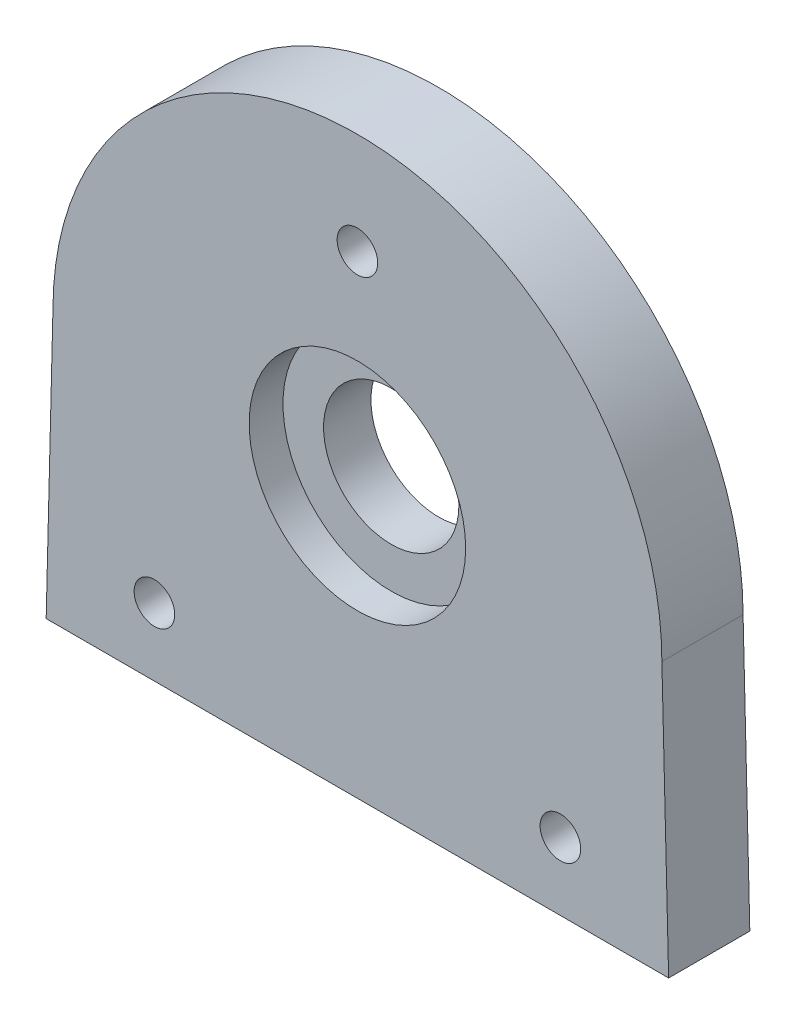
ISO-10303-21;
HEADER;
FILE_DESCRIPTION(('STEP AP214'),'2;1');
FILE_NAME('part.step','',(''),(''),'','','');
FILE_SCHEMA(('AUTOMOTIVE_DESIGN { 1 0 10303 214 1 1 1 1 }'));
ENDSEC;
DATA;
#1=APPLICATION_CONTEXT('core data for automotive mechanical design processes');
#2=APPLICATION_PROTOCOL_DEFINITION('international standard','automotive_design',2000,#1);
#3=PRODUCT_CONTEXT('',#1,'mechanical');
#4=PRODUCT('Part','Part','',(#3));
#5=PRODUCT_RELATED_PRODUCT_CATEGORY('part','',(#4));
#6=PRODUCT_DEFINITION_FORMATION('','',#4);
#7=PRODUCT_DEFINITION_CONTEXT('part definition',#1,'design');
#8=PRODUCT_DEFINITION('design','',#6,#7);
#9=PRODUCT_DEFINITION_SHAPE('','',#8);
#10=(LENGTH_UNIT() NAMED_UNIT(*) SI_UNIT(.MILLI.,.METRE.));
#11=(NAMED_UNIT(*) PLANE_ANGLE_UNIT() SI_UNIT($,.RADIAN.));
#12=(NAMED_UNIT(*) SI_UNIT($,.STERADIAN.) SOLID_ANGLE_UNIT());
#13=UNCERTAINTY_MEASURE_WITH_UNIT(LENGTH_MEASURE(1.E-05),#10,'distance_accuracy_value','');
#14=(GEOMETRIC_REPRESENTATION_CONTEXT(3) GLOBAL_UNCERTAINTY_ASSIGNED_CONTEXT((#13)) GLOBAL_UNIT_ASSIGNED_CONTEXT((#10,
#11,#12)) REPRESENTATION_CONTEXT('',''));
#15=CARTESIAN_POINT('',(0.,0.,0.));
#16=DIRECTION('',(0.,0.,1.));
#17=DIRECTION('',(1.,0.,0.));
#18=AXIS2_PLACEMENT_3D('',#15,#16,#17);
#19=CARTESIAN_POINT('',(0.,0.,-6.));
#20=DIRECTION('',(0.,0.,1.));
#21=DIRECTION('',(1.,0.,0.));
#22=AXIS2_PLACEMENT_3D('',#19,#20,#21);
#23=CYLINDRICAL_SURFACE('',#22,22.5);
#24=CARTESIAN_POINT('',(0.,0.,0.));
#25=DIRECTION('',(0.,0.,1.));
#26=DIRECTION('',(1.,0.,0.));
#27=AXIS2_PLACEMENT_3D('',#24,#25,#26);
#28=CIRCLE('',#27,22.5);
#29=CARTESIAN_POINT('',(22.5,0.,0.));
#30=VERTEX_POINT('',#29);
#31=CARTESIAN_POINT('',(-22.5,0.,0.));
#32=VERTEX_POINT('',#31);
#33=EDGE_CURVE('E100',#30,#32,#28,.T.);
#34=ORIENTED_EDGE('',*,*,#33,.F.);
#35=DIRECTION('',(0.,0.,1.));
#36=VECTOR('',#35,1.);
#37=CARTESIAN_POINT('',(22.5,0.,-6.));
#38=LINE('',#37,#36);
#39=CARTESIAN_POINT('',(22.5,0.,-6.));
#40=VERTEX_POINT('',#39);
#41=EDGE_CURVE('E11',#40,#30,#38,.T.);
#42=ORIENTED_EDGE('',*,*,#41,.F.);
#43=CARTESIAN_POINT('',(0.,0.,-6.));
#44=DIRECTION('',(0.,0.,1.));
#45=DIRECTION('',(1.,0.,0.));
#46=AXIS2_PLACEMENT_3D('',#43,#44,#45);
#47=CIRCLE('',#46,22.5);
#48=CARTESIAN_POINT('',(-22.5,0.,-6.));
#49=VERTEX_POINT('',#48);
#50=EDGE_CURVE('E93',#40,#49,#47,.T.);
#51=ORIENTED_EDGE('',*,*,#50,.T.);
#52=DIRECTION('',(0.,0.,1.));
#53=VECTOR('',#52,1.);
#54=CARTESIAN_POINT('',(-22.5,0.,-6.));
#55=LINE('',#54,#53);
#56=EDGE_CURVE('E38',#49,#32,#55,.T.);
#57=ORIENTED_EDGE('',*,*,#56,.T.);
#58=EDGE_LOOP('',(#34,#42,#51,#57));
#59=FACE_BOUND('',#58,.T.);
#60=ADVANCED_FACE('F35',(#59),#23,.T.);
#61=CARTESIAN_POINT('',(22.5,0.,-6.));
#62=DIRECTION('',(0.999688560086285,0.0249556172556395,0.));
#63=DIRECTION('',(-0.0249556172556395,0.999688560086285,0.));
#64=AXIS2_PLACEMENT_3D('',#61,#62,#63);
#65=PLANE('',#64);
#66=DIRECTION('',(-0.0249556172556395,0.999688560086285,0.));
#67=VECTOR('',#66,1.);
#68=CARTESIAN_POINT('',(22.5,0.,0.));
#69=LINE('',#68,#67);
#70=CARTESIAN_POINT('',(22.9992678370449,-20.,0.));
#71=VERTEX_POINT('',#70);
#72=EDGE_CURVE('E95',#71,#30,#69,.T.);
#73=ORIENTED_EDGE('',*,*,#72,.F.);
#74=DIRECTION('',(0.,0.,1.));
#75=VECTOR('',#74,1.);
#76=CARTESIAN_POINT('',(22.9992678370449,-20.,-6.));
#77=LINE('',#76,#75);
#78=CARTESIAN_POINT('',(22.9992678370449,-20.,-6.));
#79=VERTEX_POINT('',#78);
#80=EDGE_CURVE('E44',#79,#71,#77,.T.);
#81=ORIENTED_EDGE('',*,*,#80,.F.);
#82=DIRECTION('',(-0.0249556172556395,0.999688560086285,0.));
#83=VECTOR('',#82,1.);
#84=CARTESIAN_POINT('',(22.5,0.,-6.));
#85=LINE('',#84,#83);
#86=EDGE_CURVE('E90',#79,#40,#85,.T.);
#87=ORIENTED_EDGE('',*,*,#86,.T.);
#88=ORIENTED_EDGE('',*,*,#41,.T.);
#89=EDGE_LOOP('',(#73,#81,#87,#88));
#90=FACE_BOUND('',#89,.T.);
#91=ADVANCED_FACE('F111',(#90),#65,.T.);
#92=CARTESIAN_POINT('',(22.9992678370449,-20.,-6.));
#93=DIRECTION('',(0.,-1.,0.));
#94=DIRECTION('',(1.,0.,0.));
#95=AXIS2_PLACEMENT_3D('',#92,#93,#94);
#96=PLANE('',#95);
#97=DIRECTION('',(1.,0.,0.));
#98=VECTOR('',#97,1.);
#99=CARTESIAN_POINT('',(22.9992678370449,-20.,0.));
#100=LINE('',#99,#98);
#101=CARTESIAN_POINT('',(-22.9992678370449,-20.,0.));
#102=VERTEX_POINT('',#101);
#103=EDGE_CURVE('E84',#102,#71,#100,.T.);
#104=ORIENTED_EDGE('',*,*,#103,.F.);
#105=DIRECTION('',(0.,0.,1.));
#106=VECTOR('',#105,1.);
#107=CARTESIAN_POINT('',(-22.9992678370449,-20.,-6.));
#108=LINE('',#107,#106);
#109=CARTESIAN_POINT('',(-22.9992678370449,-20.,-6.));
#110=VERTEX_POINT('',#109);
#111=EDGE_CURVE('E80',#110,#102,#108,.T.);
#112=ORIENTED_EDGE('',*,*,#111,.F.);
#113=DIRECTION('',(1.,0.,0.));
#114=VECTOR('',#113,1.);
#115=CARTESIAN_POINT('',(0.,-20.,-6.));
#116=LINE('',#115,#114);
#117=EDGE_CURVE('E83',#110,#79,#116,.T.);
#118=ORIENTED_EDGE('',*,*,#117,.T.);
#119=ORIENTED_EDGE('',*,*,#80,.T.);
#120=EDGE_LOOP('',(#104,#112,#118,#119));
#121=FACE_BOUND('',#120,.T.);
#122=ADVANCED_FACE('F82',(#121),#96,.T.);
#123=CARTESIAN_POINT('',(-22.5,0.,-6.));
#124=DIRECTION('',(-0.999688560086285,0.0249556172556395,0.));
#125=DIRECTION('',(-0.0249556172556395,-0.999688560086285,0.));
#126=AXIS2_PLACEMENT_3D('',#123,#124,#125);
#127=PLANE('',#126);
#128=DIRECTION('',(-0.0249556172556395,-0.999688560086285,0.));
#129=VECTOR('',#128,1.);
#130=CARTESIAN_POINT('',(-22.5,0.,0.));
#131=LINE('',#130,#129);
#132=EDGE_CURVE('E103',#32,#102,#131,.T.);
#133=ORIENTED_EDGE('',*,*,#132,.F.);
#134=ORIENTED_EDGE('',*,*,#56,.F.);
#135=DIRECTION('',(-0.0249556172556395,-0.999688560086285,0.));
#136=VECTOR('',#135,1.);
#137=CARTESIAN_POINT('',(-22.5,0.,-6.));
#138=LINE('',#137,#136);
#139=EDGE_CURVE('E89',#49,#110,#138,.T.);
#140=ORIENTED_EDGE('',*,*,#139,.T.);
#141=ORIENTED_EDGE('',*,*,#111,.T.);
#142=EDGE_LOOP('',(#133,#134,#140,#141));
#143=FACE_BOUND('',#142,.T.);
#144=ADVANCED_FACE('F92',(#143),#127,.T.);
#145=CARTESIAN_POINT('',(0.,0.,-6.));
#146=DIRECTION('',(0.,0.,1.));
#147=DIRECTION('',(1.,0.,0.));
#148=AXIS2_PLACEMENT_3D('',#145,#146,#147);
#149=PLANE('',#148);
#150=CARTESIAN_POINT('',(15.,-15.,-6.));
#151=DIRECTION('',(0.,0.,1.));
#152=DIRECTION('',(1.,0.,0.));
#153=AXIS2_PLACEMENT_3D('',#150,#151,#152);
#154=CIRCLE('',#153,1.5);
#155=CARTESIAN_POINT('',(16.5,-15.,-6.));
#156=VERTEX_POINT('',#155);
#157=EDGE_CURVE('E160',#156,#156,#154,.F.);
#158=ORIENTED_EDGE('',*,*,#157,.F.);
#159=EDGE_LOOP('',(#158));
#160=FACE_BOUND('',#159,.T.);
#161=CARTESIAN_POINT('',(-15.,-15.,-6.));
#162=DIRECTION('',(0.,0.,1.));
#163=DIRECTION('',(1.,0.,0.));
#164=AXIS2_PLACEMENT_3D('',#161,#162,#163);
#165=CIRCLE('',#164,1.5);
#166=CARTESIAN_POINT('',(-13.5,-15.,-6.));
#167=VERTEX_POINT('',#166);
#168=EDGE_CURVE('E170',#167,#167,#165,.F.);
#169=ORIENTED_EDGE('',*,*,#168,.F.);
#170=EDGE_LOOP('',(#169));
#171=FACE_BOUND('',#170,.T.);
#172=CARTESIAN_POINT('',(0.,15.,-6.));
#173=DIRECTION('',(0.,0.,1.));
#174=DIRECTION('',(1.,0.,0.));
#175=AXIS2_PLACEMENT_3D('',#172,#173,#174);
#176=CIRCLE('',#175,1.5);
#177=CARTESIAN_POINT('',(1.5,15.,-6.));
#178=VERTEX_POINT('',#177);
#179=EDGE_CURVE('E176',#178,#178,#176,.F.);
#180=ORIENTED_EDGE('',*,*,#179,.F.);
#181=EDGE_LOOP('',(#180));
#182=FACE_BOUND('',#181,.T.);
#183=CARTESIAN_POINT('',(0.,0.,-6.));
#184=DIRECTION('',(0.,0.,1.));
#185=DIRECTION('',(1.,0.,0.));
#186=AXIS2_PLACEMENT_3D('',#183,#184,#185);
#187=CIRCLE('',#186,5.);
#188=CARTESIAN_POINT('',(5.,0.,-6.));
#189=VERTEX_POINT('',#188);
#190=EDGE_CURVE('E182',#189,#189,#187,.F.);
#191=ORIENTED_EDGE('',*,*,#190,.F.);
#192=EDGE_LOOP('',(#191));
#193=FACE_BOUND('',#192,.T.);
#194=ORIENTED_EDGE('',*,*,#50,.F.);
#195=ORIENTED_EDGE('',*,*,#86,.F.);
#196=ORIENTED_EDGE('',*,*,#117,.F.);
#197=ORIENTED_EDGE('',*,*,#139,.F.);
#198=EDGE_LOOP('',(#194,#195,#196,#197));
#199=FACE_BOUND('',#198,.T.);
#200=ADVANCED_FACE('F88',(#160,#171,#182,#193,#199),#149,.F.);
#201=CARTESIAN_POINT('',(0.,0.,0.));
#202=DIRECTION('',(0.,0.,1.));
#203=DIRECTION('',(1.,0.,0.));
#204=AXIS2_PLACEMENT_3D('',#201,#202,#203);
#205=PLANE('',#204);
#206=CARTESIAN_POINT('',(15.,-15.,0.));
#207=DIRECTION('',(0.,0.,1.));
#208=DIRECTION('',(1.,0.,0.));
#209=AXIS2_PLACEMENT_3D('',#206,#207,#208);
#210=CIRCLE('',#209,1.5);
#211=CARTESIAN_POINT('',(16.5,-15.,0.));
#212=VERTEX_POINT('',#211);
#213=EDGE_CURVE('E163',#212,#212,#210,.T.);
#214=ORIENTED_EDGE('',*,*,#213,.F.);
#215=EDGE_LOOP('',(#214));
#216=FACE_BOUND('',#215,.T.);
#217=CARTESIAN_POINT('',(-15.,-15.,0.));
#218=DIRECTION('',(0.,0.,1.));
#219=DIRECTION('',(1.,0.,0.));
#220=AXIS2_PLACEMENT_3D('',#217,#218,#219);
#221=CIRCLE('',#220,1.5);
#222=CARTESIAN_POINT('',(-13.5,-15.,0.));
#223=VERTEX_POINT('',#222);
#224=EDGE_CURVE('E165',#223,#223,#221,.T.);
#225=ORIENTED_EDGE('',*,*,#224,.F.);
#226=EDGE_LOOP('',(#225));
#227=FACE_BOUND('',#226,.T.);
#228=CARTESIAN_POINT('',(0.,15.,0.));
#229=DIRECTION('',(0.,0.,1.));
#230=DIRECTION('',(1.,0.,0.));
#231=AXIS2_PLACEMENT_3D('',#228,#229,#230);
#232=CIRCLE('',#231,1.5);
#233=CARTESIAN_POINT('',(1.5,15.,0.));
#234=VERTEX_POINT('',#233);
#235=EDGE_CURVE('E173',#234,#234,#232,.T.);
#236=ORIENTED_EDGE('',*,*,#235,.F.);
#237=EDGE_LOOP('',(#236));
#238=FACE_BOUND('',#237,.T.);
#239=CARTESIAN_POINT('',(0.,0.,0.));
#240=DIRECTION('',(0.,0.,1.));
#241=DIRECTION('',(1.,0.,0.));
#242=AXIS2_PLACEMENT_3D('',#239,#240,#241);
#243=CIRCLE('',#242,8.);
#244=CARTESIAN_POINT('',(8.,0.,0.));
#245=VERTEX_POINT('',#244);
#246=EDGE_CURVE('E185',#245,#245,#243,.T.);
#247=ORIENTED_EDGE('',*,*,#246,.F.);
#248=EDGE_LOOP('',(#247));
#249=FACE_BOUND('',#248,.T.);
#250=ORIENTED_EDGE('',*,*,#33,.T.);
#251=ORIENTED_EDGE('',*,*,#132,.T.);
#252=ORIENTED_EDGE('',*,*,#103,.T.);
#253=ORIENTED_EDGE('',*,*,#72,.T.);
#254=EDGE_LOOP('',(#250,#251,#252,#253));
#255=FACE_BOUND('',#254,.T.);
#256=ADVANCED_FACE('F110',(#216,#227,#238,#249,#255),#205,.T.);
#257=CARTESIAN_POINT('',(0.,0.,-2.5));
#258=DIRECTION('',(0.,0.,1.));
#259=DIRECTION('',(1.,0.,0.));
#260=AXIS2_PLACEMENT_3D('',#257,#258,#259);
#261=CYLINDRICAL_SURFACE('',#260,8.);
#262=CARTESIAN_POINT('',(0.,0.,-2.5));
#263=DIRECTION('',(0.,0.,1.));
#264=DIRECTION('',(1.,0.,0.));
#265=AXIS2_PLACEMENT_3D('',#262,#263,#264);
#266=CIRCLE('',#265,8.);
#267=CARTESIAN_POINT('',(8.,0.,-2.5));
#268=VERTEX_POINT('',#267);
#269=EDGE_CURVE('E104',#268,#268,#266,.T.);
#270=ORIENTED_EDGE('',*,*,#269,.F.);
#271=EDGE_LOOP('',(#270));
#272=FACE_BOUND('',#271,.T.);
#273=ORIENTED_EDGE('',*,*,#246,.T.);
#274=EDGE_LOOP('',(#273));
#275=FACE_BOUND('',#274,.T.);
#276=ADVANCED_FACE('F129',(#272,#275),#261,.F.);
#277=CARTESIAN_POINT('',(0.,0.,-2.5));
#278=DIRECTION('',(0.,0.,1.));
#279=DIRECTION('',(1.,0.,0.));
#280=AXIS2_PLACEMENT_3D('',#277,#278,#279);
#281=PLANE('',#280);
#282=CARTESIAN_POINT('',(0.,0.,-2.5));
#283=DIRECTION('',(0.,0.,1.));
#284=DIRECTION('',(1.,0.,0.));
#285=AXIS2_PLACEMENT_3D('',#282,#283,#284);
#286=CIRCLE('',#285,5.);
#287=CARTESIAN_POINT('',(5.,0.,-2.5));
#288=VERTEX_POINT('',#287);
#289=EDGE_CURVE('E179',#288,#288,#286,.T.);
#290=ORIENTED_EDGE('',*,*,#289,.F.);
#291=EDGE_LOOP('',(#290));
#292=FACE_BOUND('',#291,.T.);
#293=ORIENTED_EDGE('',*,*,#269,.T.);
#294=EDGE_LOOP('',(#293));
#295=FACE_BOUND('',#294,.T.);
#296=ADVANCED_FACE('F136',(#292,#295),#281,.T.);
#297=CARTESIAN_POINT('',(0.,0.,-20.142135623731));
#298=DIRECTION('',(0.,0.,1.));
#299=DIRECTION('',(1.,0.,0.));
#300=AXIS2_PLACEMENT_3D('',#297,#298,#299);
#301=CYLINDRICAL_SURFACE('',#300,5.);
#302=ORIENTED_EDGE('',*,*,#190,.T.);
#303=EDGE_LOOP('',(#302));
#304=FACE_BOUND('',#303,.T.);
#305=ORIENTED_EDGE('',*,*,#289,.T.);
#306=EDGE_LOOP('',(#305));
#307=FACE_BOUND('',#306,.T.);
#308=ADVANCED_FACE('F140',(#304,#307),#301,.F.);
#309=CARTESIAN_POINT('',(0.,15.,-10.2426406871193));
#310=DIRECTION('',(0.,0.,1.));
#311=DIRECTION('',(1.,0.,0.));
#312=AXIS2_PLACEMENT_3D('',#309,#310,#311);
#313=CYLINDRICAL_SURFACE('',#312,1.5);
#314=ORIENTED_EDGE('',*,*,#179,.T.);
#315=EDGE_LOOP('',(#314));
#316=FACE_BOUND('',#315,.T.);
#317=ORIENTED_EDGE('',*,*,#235,.T.);
#318=EDGE_LOOP('',(#317));
#319=FACE_BOUND('',#318,.T.);
#320=ADVANCED_FACE('F144',(#316,#319),#313,.F.);
#321=CARTESIAN_POINT('',(-15.,-15.,-10.2426406871193));
#322=DIRECTION('',(0.,0.,1.));
#323=DIRECTION('',(1.,0.,0.));
#324=AXIS2_PLACEMENT_3D('',#321,#322,#323);
#325=CYLINDRICAL_SURFACE('',#324,1.5);
#326=ORIENTED_EDGE('',*,*,#168,.T.);
#327=EDGE_LOOP('',(#326));
#328=FACE_BOUND('',#327,.T.);
#329=ORIENTED_EDGE('',*,*,#224,.T.);
#330=EDGE_LOOP('',(#329));
#331=FACE_BOUND('',#330,.T.);
#332=ADVANCED_FACE('F148',(#328,#331),#325,.F.);
#333=CARTESIAN_POINT('',(15.,-15.,-10.2426406871193));
#334=DIRECTION('',(0.,0.,1.));
#335=DIRECTION('',(1.,0.,0.));
#336=AXIS2_PLACEMENT_3D('',#333,#334,#335);
#337=CYLINDRICAL_SURFACE('',#336,1.5);
#338=ORIENTED_EDGE('',*,*,#157,.T.);
#339=EDGE_LOOP('',(#338));
#340=FACE_BOUND('',#339,.T.);
#341=ORIENTED_EDGE('',*,*,#213,.T.);
#342=EDGE_LOOP('',(#341));
#343=FACE_BOUND('',#342,.T.);
#344=ADVANCED_FACE('F152',(#340,#343),#337,.F.);
#345=CLOSED_SHELL('',(#60,#91,#122,#144,#200,#256,#276,#296,#308,#320,#332,#344));
#346=MANIFOLD_SOLID_BREP('B2',#345);
#347=ADVANCED_BREP_SHAPE_REPRESENTATION('',(#18,#346),#14);
#348=SHAPE_DEFINITION_REPRESENTATION(#9,#347);
ENDSEC;
END-ISO-10303-21;
